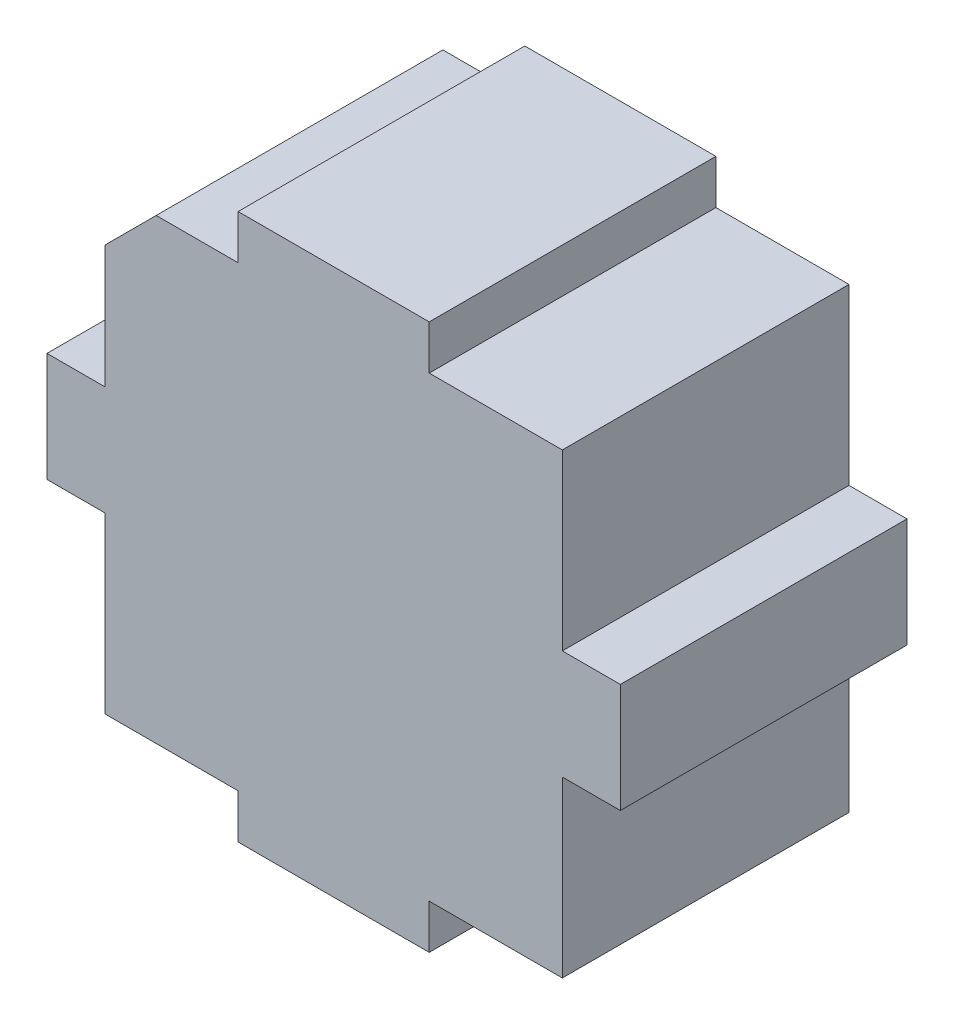
ISO-10303-21;
HEADER;
FILE_DESCRIPTION(('STEP AP214'),'2;1');
FILE_NAME('part.step','',(''),(''),'','','');
FILE_SCHEMA(('AUTOMOTIVE_DESIGN { 1 0 10303 214 1 1 1 1 }'));
ENDSEC;
DATA;
#1=APPLICATION_CONTEXT('core data for automotive mechanical design processes');
#2=APPLICATION_PROTOCOL_DEFINITION('international standard','automotive_design',2000,#1);
#3=PRODUCT_CONTEXT('',#1,'mechanical');
#4=PRODUCT('Part','Part','',(#3));
#5=PRODUCT_RELATED_PRODUCT_CATEGORY('part','',(#4));
#6=PRODUCT_DEFINITION_FORMATION('','',#4);
#7=PRODUCT_DEFINITION_CONTEXT('part definition',#1,'design');
#8=PRODUCT_DEFINITION('design','',#6,#7);
#9=PRODUCT_DEFINITION_SHAPE('','',#8);
#10=(LENGTH_UNIT() NAMED_UNIT(*) SI_UNIT(.MILLI.,.METRE.));
#11=(NAMED_UNIT(*) PLANE_ANGLE_UNIT() SI_UNIT($,.RADIAN.));
#12=(NAMED_UNIT(*) SI_UNIT($,.STERADIAN.) SOLID_ANGLE_UNIT());
#13=UNCERTAINTY_MEASURE_WITH_UNIT(LENGTH_MEASURE(1.E-05),#10,'distance_accuracy_value','');
#14=(GEOMETRIC_REPRESENTATION_CONTEXT(3) GLOBAL_UNCERTAINTY_ASSIGNED_CONTEXT((#13)) GLOBAL_UNIT_ASSIGNED_CONTEXT((#10,
#11,#12)) REPRESENTATION_CONTEXT('',''));
#15=CARTESIAN_POINT('',(0.,0.,0.));
#16=DIRECTION('',(0.,0.,1.));
#17=DIRECTION('',(1.,0.,0.));
#18=AXIS2_PLACEMENT_3D('',#15,#16,#17);
#19=CARTESIAN_POINT('',(-0.7,2.,2.1));
#20=DIRECTION('',(0.,-1.,0.));
#21=DIRECTION('',(0.,0.,-1.));
#22=AXIS2_PLACEMENT_3D('',#19,#20,#21);
#23=PLANE('',#22);
#24=DIRECTION('',(-1.,0.,0.));
#25=VECTOR('',#24,1.);
#26=CARTESIAN_POINT('',(-0.7,2.,0.));
#27=LINE('',#26,#25);
#28=CARTESIAN_POINT('',(0.7,2.,0.));
#29=VERTEX_POINT('',#28);
#30=CARTESIAN_POINT('',(-0.7,2.,0.));
#31=VERTEX_POINT('',#30);
#32=EDGE_CURVE('E208',#29,#31,#27,.T.);
#33=ORIENTED_EDGE('',*,*,#32,.T.);
#34=DIRECTION('',(0.,0.,-1.));
#35=VECTOR('',#34,1.);
#36=CARTESIAN_POINT('',(-0.7,2.,2.1));
#37=LINE('',#36,#35);
#38=CARTESIAN_POINT('',(-0.7,2.,2.1));
#39=VERTEX_POINT('',#38);
#40=EDGE_CURVE('E11',#39,#31,#37,.T.);
#41=ORIENTED_EDGE('',*,*,#40,.F.);
#42=DIRECTION('',(-1.,0.,0.));
#43=VECTOR('',#42,1.);
#44=CARTESIAN_POINT('',(-0.7,2.,2.1));
#45=LINE('',#44,#43);
#46=CARTESIAN_POINT('',(0.7,2.,2.1));
#47=VERTEX_POINT('',#46);
#48=EDGE_CURVE('E248',#47,#39,#45,.T.);
#49=ORIENTED_EDGE('',*,*,#48,.F.);
#50=DIRECTION('',(0.,0.,-1.));
#51=VECTOR('',#50,1.);
#52=CARTESIAN_POINT('',(0.7,2.,2.1));
#53=LINE('',#52,#51);
#54=EDGE_CURVE('E204',#47,#29,#53,.T.);
#55=ORIENTED_EDGE('',*,*,#54,.T.);
#56=EDGE_LOOP('',(#33,#41,#49,#55));
#57=FACE_BOUND('',#56,.T.);
#58=ADVANCED_FACE('F34',(#57),#23,.F.);
#59=CARTESIAN_POINT('',(-0.7,1.675,2.1));
#60=DIRECTION('',(1.,0.,0.));
#61=DIRECTION('',(0.,0.,-1.));
#62=AXIS2_PLACEMENT_3D('',#59,#60,#61);
#63=PLANE('',#62);
#64=DIRECTION('',(0.,-1.,0.));
#65=VECTOR('',#64,1.);
#66=CARTESIAN_POINT('',(-0.7,1.675,0.));
#67=LINE('',#66,#65);
#68=CARTESIAN_POINT('',(-0.7,1.675,0.));
#69=VERTEX_POINT('',#68);
#70=EDGE_CURVE('E211',#31,#69,#67,.T.);
#71=ORIENTED_EDGE('',*,*,#70,.T.);
#72=DIRECTION('',(0.,0.,-1.));
#73=VECTOR('',#72,1.);
#74=CARTESIAN_POINT('',(-0.7,1.675,2.1));
#75=LINE('',#74,#73);
#76=CARTESIAN_POINT('',(-0.7,1.675,2.1));
#77=VERTEX_POINT('',#76);
#78=EDGE_CURVE('E42',#77,#69,#75,.T.);
#79=ORIENTED_EDGE('',*,*,#78,.F.);
#80=DIRECTION('',(0.,-1.,0.));
#81=VECTOR('',#80,1.);
#82=CARTESIAN_POINT('',(-0.7,1.675,2.1));
#83=LINE('',#82,#81);
#84=EDGE_CURVE('E132',#39,#77,#83,.T.);
#85=ORIENTED_EDGE('',*,*,#84,.F.);
#86=ORIENTED_EDGE('',*,*,#40,.T.);
#87=EDGE_LOOP('',(#71,#79,#85,#86));
#88=FACE_BOUND('',#87,.T.);
#89=ADVANCED_FACE('F371',(#88),#63,.F.);
#90=CARTESIAN_POINT('',(-1.3,1.675,2.1));
#91=DIRECTION('',(0.,-1.,0.));
#92=DIRECTION('',(0.,0.,-1.));
#93=AXIS2_PLACEMENT_3D('',#90,#91,#92);
#94=PLANE('',#93);
#95=DIRECTION('',(-1.,0.,0.));
#96=VECTOR('',#95,1.);
#97=CARTESIAN_POINT('',(-1.3,1.675,0.));
#98=LINE('',#97,#96);
#99=CARTESIAN_POINT('',(-1.3,1.675,0.));
#100=VERTEX_POINT('',#99);
#101=EDGE_CURVE('E213',#69,#100,#98,.T.);
#102=ORIENTED_EDGE('',*,*,#101,.T.);
#103=DIRECTION('',(0.,0.,-1.));
#104=VECTOR('',#103,1.);
#105=CARTESIAN_POINT('',(-1.3,1.675,2.1));
#106=LINE('',#105,#104);
#107=CARTESIAN_POINT('',(-1.3,1.675,2.1));
#108=VERTEX_POINT('',#107);
#109=EDGE_CURVE('E294',#108,#100,#106,.T.);
#110=ORIENTED_EDGE('',*,*,#109,.F.);
#111=DIRECTION('',(-1.,0.,0.));
#112=VECTOR('',#111,1.);
#113=CARTESIAN_POINT('',(-1.3,1.675,2.1));
#114=LINE('',#113,#112);
#115=EDGE_CURVE('E302',#77,#108,#114,.T.);
#116=ORIENTED_EDGE('',*,*,#115,.F.);
#117=ORIENTED_EDGE('',*,*,#78,.T.);
#118=EDGE_LOOP('',(#102,#110,#116,#117));
#119=FACE_BOUND('',#118,.T.);
#120=ADVANCED_FACE('F300',(#119),#94,.F.);
#121=CARTESIAN_POINT('',(-1.675,1.3,2.1));
#122=DIRECTION('',(0.707106781186548,-0.707106781186548,0.));
#123=DIRECTION('',(0.707106781186548,0.707106781186548,0.));
#124=AXIS2_PLACEMENT_3D('',#121,#122,#123);
#125=PLANE('',#124);
#126=DIRECTION('',(-0.707106781186547,-0.707106781186547,0.));
#127=VECTOR('',#126,1.);
#128=CARTESIAN_POINT('',(-1.675,1.3,0.));
#129=LINE('',#128,#127);
#130=CARTESIAN_POINT('',(-1.675,1.3,0.));
#131=VERTEX_POINT('',#130);
#132=EDGE_CURVE('E215',#100,#131,#129,.T.);
#133=ORIENTED_EDGE('',*,*,#132,.T.);
#134=DIRECTION('',(0.,0.,-1.));
#135=VECTOR('',#134,1.);
#136=CARTESIAN_POINT('',(-1.675,1.3,2.1));
#137=LINE('',#136,#135);
#138=CARTESIAN_POINT('',(-1.675,1.3,2.1));
#139=VERTEX_POINT('',#138);
#140=EDGE_CURVE('E291',#139,#131,#137,.T.);
#141=ORIENTED_EDGE('',*,*,#140,.F.);
#142=DIRECTION('',(-0.707106781186547,-0.707106781186547,0.));
#143=VECTOR('',#142,1.);
#144=CARTESIAN_POINT('',(-1.675,1.3,2.1));
#145=LINE('',#144,#143);
#146=EDGE_CURVE('E320',#108,#139,#145,.T.);
#147=ORIENTED_EDGE('',*,*,#146,.F.);
#148=ORIENTED_EDGE('',*,*,#109,.T.);
#149=EDGE_LOOP('',(#133,#141,#147,#148));
#150=FACE_BOUND('',#149,.T.);
#151=ADVANCED_FACE('F311',(#150),#125,.F.);
#152=CARTESIAN_POINT('',(-1.675,0.4,2.1));
#153=DIRECTION('',(1.,0.,0.));
#154=DIRECTION('',(0.,0.,-1.));
#155=AXIS2_PLACEMENT_3D('',#152,#153,#154);
#156=PLANE('',#155);
#157=DIRECTION('',(0.,-1.,0.));
#158=VECTOR('',#157,1.);
#159=CARTESIAN_POINT('',(-1.675,0.4,0.));
#160=LINE('',#159,#158);
#161=CARTESIAN_POINT('',(-1.675,0.4,0.));
#162=VERTEX_POINT('',#161);
#163=EDGE_CURVE('E217',#131,#162,#160,.T.);
#164=ORIENTED_EDGE('',*,*,#163,.T.);
#165=DIRECTION('',(0.,0.,-1.));
#166=VECTOR('',#165,1.);
#167=CARTESIAN_POINT('',(-1.675,0.4,2.1));
#168=LINE('',#167,#166);
#169=CARTESIAN_POINT('',(-1.675,0.4,2.1));
#170=VERTEX_POINT('',#169);
#171=EDGE_CURVE('E288',#170,#162,#168,.T.);
#172=ORIENTED_EDGE('',*,*,#171,.F.);
#173=DIRECTION('',(0.,-1.,0.));
#174=VECTOR('',#173,1.);
#175=CARTESIAN_POINT('',(-1.675,0.4,2.1));
#176=LINE('',#175,#174);
#177=EDGE_CURVE('E317',#139,#170,#176,.T.);
#178=ORIENTED_EDGE('',*,*,#177,.F.);
#179=ORIENTED_EDGE('',*,*,#140,.T.);
#180=EDGE_LOOP('',(#164,#172,#178,#179));
#181=FACE_BOUND('',#180,.T.);
#182=ADVANCED_FACE('F315',(#181),#156,.F.);
#183=CARTESIAN_POINT('',(-2.1,0.4,2.1));
#184=DIRECTION('',(0.,-1.,0.));
#185=DIRECTION('',(0.,0.,-1.));
#186=AXIS2_PLACEMENT_3D('',#183,#184,#185);
#187=PLANE('',#186);
#188=DIRECTION('',(-1.,0.,0.));
#189=VECTOR('',#188,1.);
#190=CARTESIAN_POINT('',(-2.1,0.4,0.));
#191=LINE('',#190,#189);
#192=CARTESIAN_POINT('',(-2.1,0.4,0.));
#193=VERTEX_POINT('',#192);
#194=EDGE_CURVE('E219',#162,#193,#191,.T.);
#195=ORIENTED_EDGE('',*,*,#194,.T.);
#196=DIRECTION('',(0.,0.,-1.));
#197=VECTOR('',#196,1.);
#198=CARTESIAN_POINT('',(-2.1,0.4,2.1));
#199=LINE('',#198,#197);
#200=CARTESIAN_POINT('',(-2.1,0.4,2.1));
#201=VERTEX_POINT('',#200);
#202=EDGE_CURVE('E285',#201,#193,#199,.T.);
#203=ORIENTED_EDGE('',*,*,#202,.F.);
#204=DIRECTION('',(-1.,0.,0.));
#205=VECTOR('',#204,1.);
#206=CARTESIAN_POINT('',(-2.1,0.4,2.1));
#207=LINE('',#206,#205);
#208=EDGE_CURVE('E319',#170,#201,#207,.T.);
#209=ORIENTED_EDGE('',*,*,#208,.F.);
#210=ORIENTED_EDGE('',*,*,#171,.T.);
#211=EDGE_LOOP('',(#195,#203,#209,#210));
#212=FACE_BOUND('',#211,.T.);
#213=ADVANCED_FACE('F384',(#212),#187,.F.);
#214=CARTESIAN_POINT('',(-2.1,-0.4,2.1));
#215=DIRECTION('',(1.,0.,0.));
#216=DIRECTION('',(0.,0.,-1.));
#217=AXIS2_PLACEMENT_3D('',#214,#215,#216);
#218=PLANE('',#217);
#219=DIRECTION('',(0.,-1.,0.));
#220=VECTOR('',#219,1.);
#221=CARTESIAN_POINT('',(-2.1,-0.4,0.));
#222=LINE('',#221,#220);
#223=CARTESIAN_POINT('',(-2.1,-0.4,0.));
#224=VERTEX_POINT('',#223);
#225=EDGE_CURVE('E221',#193,#224,#222,.T.);
#226=ORIENTED_EDGE('',*,*,#225,.T.);
#227=DIRECTION('',(0.,0.,-1.));
#228=VECTOR('',#227,1.);
#229=CARTESIAN_POINT('',(-2.1,-0.4,2.1));
#230=LINE('',#229,#228);
#231=CARTESIAN_POINT('',(-2.1,-0.4,2.1));
#232=VERTEX_POINT('',#231);
#233=EDGE_CURVE('E282',#232,#224,#230,.T.);
#234=ORIENTED_EDGE('',*,*,#233,.F.);
#235=DIRECTION('',(0.,-1.,0.));
#236=VECTOR('',#235,1.);
#237=CARTESIAN_POINT('',(-2.1,-0.4,2.1));
#238=LINE('',#237,#236);
#239=EDGE_CURVE('E322',#201,#232,#238,.T.);
#240=ORIENTED_EDGE('',*,*,#239,.F.);
#241=ORIENTED_EDGE('',*,*,#202,.T.);
#242=EDGE_LOOP('',(#226,#234,#240,#241));
#243=FACE_BOUND('',#242,.T.);
#244=ADVANCED_FACE('F387',(#243),#218,.F.);
#245=CARTESIAN_POINT('',(-1.675,-0.4,2.1));
#246=DIRECTION('',(0.,1.,0.));
#247=DIRECTION('',(0.,0.,1.));
#248=AXIS2_PLACEMENT_3D('',#245,#246,#247);
#249=PLANE('',#248);
#250=DIRECTION('',(1.,0.,0.));
#251=VECTOR('',#250,1.);
#252=CARTESIAN_POINT('',(-1.675,-0.4,0.));
#253=LINE('',#252,#251);
#254=CARTESIAN_POINT('',(-1.675,-0.4,0.));
#255=VERTEX_POINT('',#254);
#256=EDGE_CURVE('E223',#224,#255,#253,.T.);
#257=ORIENTED_EDGE('',*,*,#256,.T.);
#258=DIRECTION('',(0.,0.,-1.));
#259=VECTOR('',#258,1.);
#260=CARTESIAN_POINT('',(-1.675,-0.4,2.1));
#261=LINE('',#260,#259);
#262=CARTESIAN_POINT('',(-1.675,-0.4,2.1));
#263=VERTEX_POINT('',#262);
#264=EDGE_CURVE('E279',#263,#255,#261,.T.);
#265=ORIENTED_EDGE('',*,*,#264,.F.);
#266=DIRECTION('',(1.,0.,0.));
#267=VECTOR('',#266,1.);
#268=CARTESIAN_POINT('',(-1.675,-0.4,2.1));
#269=LINE('',#268,#267);
#270=EDGE_CURVE('E328',#232,#263,#269,.T.);
#271=ORIENTED_EDGE('',*,*,#270,.F.);
#272=ORIENTED_EDGE('',*,*,#233,.T.);
#273=EDGE_LOOP('',(#257,#265,#271,#272));
#274=FACE_BOUND('',#273,.T.);
#275=ADVANCED_FACE('F391',(#274),#249,.F.);
#276=CARTESIAN_POINT('',(-1.675,-1.675,2.1));
#277=DIRECTION('',(1.,0.,0.));
#278=DIRECTION('',(0.,0.,-1.));
#279=AXIS2_PLACEMENT_3D('',#276,#277,#278);
#280=PLANE('',#279);
#281=DIRECTION('',(0.,-1.,0.));
#282=VECTOR('',#281,1.);
#283=CARTESIAN_POINT('',(-1.675,-1.675,0.));
#284=LINE('',#283,#282);
#285=CARTESIAN_POINT('',(-1.675,-1.675,0.));
#286=VERTEX_POINT('',#285);
#287=EDGE_CURVE('E225',#255,#286,#284,.T.);
#288=ORIENTED_EDGE('',*,*,#287,.T.);
#289=DIRECTION('',(0.,0.,-1.));
#290=VECTOR('',#289,1.);
#291=CARTESIAN_POINT('',(-1.675,-1.675,2.1));
#292=LINE('',#291,#290);
#293=CARTESIAN_POINT('',(-1.675,-1.675,2.1));
#294=VERTEX_POINT('',#293);
#295=EDGE_CURVE('E276',#294,#286,#292,.T.);
#296=ORIENTED_EDGE('',*,*,#295,.F.);
#297=DIRECTION('',(0.,-1.,0.));
#298=VECTOR('',#297,1.);
#299=CARTESIAN_POINT('',(-1.675,-1.675,2.1));
#300=LINE('',#299,#298);
#301=EDGE_CURVE('E330',#263,#294,#300,.T.);
#302=ORIENTED_EDGE('',*,*,#301,.F.);
#303=ORIENTED_EDGE('',*,*,#264,.T.);
#304=EDGE_LOOP('',(#288,#296,#302,#303));
#305=FACE_BOUND('',#304,.T.);
#306=ADVANCED_FACE('F395',(#305),#280,.F.);
#307=CARTESIAN_POINT('',(-0.7,-1.675,2.1));
#308=DIRECTION('',(0.,1.,0.));
#309=DIRECTION('',(0.,0.,1.));
#310=AXIS2_PLACEMENT_3D('',#307,#308,#309);
#311=PLANE('',#310);
#312=DIRECTION('',(1.,0.,0.));
#313=VECTOR('',#312,1.);
#314=CARTESIAN_POINT('',(-0.7,-1.675,0.));
#315=LINE('',#314,#313);
#316=CARTESIAN_POINT('',(-0.7,-1.675,0.));
#317=VERTEX_POINT('',#316);
#318=EDGE_CURVE('E227',#286,#317,#315,.T.);
#319=ORIENTED_EDGE('',*,*,#318,.T.);
#320=DIRECTION('',(0.,0.,-1.));
#321=VECTOR('',#320,1.);
#322=CARTESIAN_POINT('',(-0.7,-1.675,2.1));
#323=LINE('',#322,#321);
#324=CARTESIAN_POINT('',(-0.7,-1.675,2.1));
#325=VERTEX_POINT('',#324);
#326=EDGE_CURVE('E273',#325,#317,#323,.T.);
#327=ORIENTED_EDGE('',*,*,#326,.F.);
#328=DIRECTION('',(1.,0.,0.));
#329=VECTOR('',#328,1.);
#330=CARTESIAN_POINT('',(-0.7,-1.675,2.1));
#331=LINE('',#330,#329);
#332=EDGE_CURVE('E332',#294,#325,#331,.T.);
#333=ORIENTED_EDGE('',*,*,#332,.F.);
#334=ORIENTED_EDGE('',*,*,#295,.T.);
#335=EDGE_LOOP('',(#319,#327,#333,#334));
#336=FACE_BOUND('',#335,.T.);
#337=ADVANCED_FACE('F399',(#336),#311,.F.);
#338=CARTESIAN_POINT('',(-0.7,-2.,2.1));
#339=DIRECTION('',(1.,0.,0.));
#340=DIRECTION('',(0.,0.,-1.));
#341=AXIS2_PLACEMENT_3D('',#338,#339,#340);
#342=PLANE('',#341);
#343=DIRECTION('',(0.,-1.,0.));
#344=VECTOR('',#343,1.);
#345=CARTESIAN_POINT('',(-0.7,-2.,0.));
#346=LINE('',#345,#344);
#347=CARTESIAN_POINT('',(-0.7,-2.,0.));
#348=VERTEX_POINT('',#347);
#349=EDGE_CURVE('E229',#317,#348,#346,.T.);
#350=ORIENTED_EDGE('',*,*,#349,.T.);
#351=DIRECTION('',(0.,0.,-1.));
#352=VECTOR('',#351,1.);
#353=CARTESIAN_POINT('',(-0.7,-2.,2.1));
#354=LINE('',#353,#352);
#355=CARTESIAN_POINT('',(-0.7,-2.,2.1));
#356=VERTEX_POINT('',#355);
#357=EDGE_CURVE('E270',#356,#348,#354,.T.);
#358=ORIENTED_EDGE('',*,*,#357,.F.);
#359=DIRECTION('',(0.,-1.,0.));
#360=VECTOR('',#359,1.);
#361=CARTESIAN_POINT('',(-0.7,-2.,2.1));
#362=LINE('',#361,#360);
#363=EDGE_CURVE('E334',#325,#356,#362,.T.);
#364=ORIENTED_EDGE('',*,*,#363,.F.);
#365=ORIENTED_EDGE('',*,*,#326,.T.);
#366=EDGE_LOOP('',(#350,#358,#364,#365));
#367=FACE_BOUND('',#366,.T.);
#368=ADVANCED_FACE('F403',(#367),#342,.F.);
#369=CARTESIAN_POINT('',(0.7,-2.,2.1));
#370=DIRECTION('',(0.,1.,0.));
#371=DIRECTION('',(0.,0.,1.));
#372=AXIS2_PLACEMENT_3D('',#369,#370,#371);
#373=PLANE('',#372);
#374=DIRECTION('',(1.,0.,0.));
#375=VECTOR('',#374,1.);
#376=CARTESIAN_POINT('',(0.7,-2.,0.));
#377=LINE('',#376,#375);
#378=CARTESIAN_POINT('',(0.7,-2.,0.));
#379=VERTEX_POINT('',#378);
#380=EDGE_CURVE('E231',#348,#379,#377,.T.);
#381=ORIENTED_EDGE('',*,*,#380,.T.);
#382=DIRECTION('',(0.,0.,-1.));
#383=VECTOR('',#382,1.);
#384=CARTESIAN_POINT('',(0.7,-2.,2.1));
#385=LINE('',#384,#383);
#386=CARTESIAN_POINT('',(0.7,-2.,2.1));
#387=VERTEX_POINT('',#386);
#388=EDGE_CURVE('E267',#387,#379,#385,.T.);
#389=ORIENTED_EDGE('',*,*,#388,.F.);
#390=DIRECTION('',(1.,0.,0.));
#391=VECTOR('',#390,1.);
#392=CARTESIAN_POINT('',(0.7,-2.,2.1));
#393=LINE('',#392,#391);
#394=EDGE_CURVE('E336',#356,#387,#393,.T.);
#395=ORIENTED_EDGE('',*,*,#394,.F.);
#396=ORIENTED_EDGE('',*,*,#357,.T.);
#397=EDGE_LOOP('',(#381,#389,#395,#396));
#398=FACE_BOUND('',#397,.T.);
#399=ADVANCED_FACE('F407',(#398),#373,.F.);
#400=CARTESIAN_POINT('',(0.7,-1.675,2.1));
#401=DIRECTION('',(-1.,0.,0.));
#402=DIRECTION('',(0.,0.,1.));
#403=AXIS2_PLACEMENT_3D('',#400,#401,#402);
#404=PLANE('',#403);
#405=DIRECTION('',(0.,1.,0.));
#406=VECTOR('',#405,1.);
#407=CARTESIAN_POINT('',(0.7,-1.675,0.));
#408=LINE('',#407,#406);
#409=CARTESIAN_POINT('',(0.7,-1.675,0.));
#410=VERTEX_POINT('',#409);
#411=EDGE_CURVE('E233',#379,#410,#408,.T.);
#412=ORIENTED_EDGE('',*,*,#411,.T.);
#413=DIRECTION('',(0.,0.,-1.));
#414=VECTOR('',#413,1.);
#415=CARTESIAN_POINT('',(0.7,-1.675,2.1));
#416=LINE('',#415,#414);
#417=CARTESIAN_POINT('',(0.7,-1.675,2.1));
#418=VERTEX_POINT('',#417);
#419=EDGE_CURVE('E264',#418,#410,#416,.T.);
#420=ORIENTED_EDGE('',*,*,#419,.F.);
#421=DIRECTION('',(0.,1.,0.));
#422=VECTOR('',#421,1.);
#423=CARTESIAN_POINT('',(0.7,-1.675,2.1));
#424=LINE('',#423,#422);
#425=EDGE_CURVE('E338',#387,#418,#424,.T.);
#426=ORIENTED_EDGE('',*,*,#425,.F.);
#427=ORIENTED_EDGE('',*,*,#388,.T.);
#428=EDGE_LOOP('',(#412,#420,#426,#427));
#429=FACE_BOUND('',#428,.T.);
#430=ADVANCED_FACE('F411',(#429),#404,.F.);
#431=CARTESIAN_POINT('',(1.675,-1.675,2.1));
#432=DIRECTION('',(0.,1.,0.));
#433=DIRECTION('',(0.,0.,1.));
#434=AXIS2_PLACEMENT_3D('',#431,#432,#433);
#435=PLANE('',#434);
#436=DIRECTION('',(1.,0.,0.));
#437=VECTOR('',#436,1.);
#438=CARTESIAN_POINT('',(1.675,-1.675,0.));
#439=LINE('',#438,#437);
#440=CARTESIAN_POINT('',(1.675,-1.675,0.));
#441=VERTEX_POINT('',#440);
#442=EDGE_CURVE('E235',#410,#441,#439,.T.);
#443=ORIENTED_EDGE('',*,*,#442,.T.);
#444=DIRECTION('',(0.,0.,-1.));
#445=VECTOR('',#444,1.);
#446=CARTESIAN_POINT('',(1.675,-1.675,2.1));
#447=LINE('',#446,#445);
#448=CARTESIAN_POINT('',(1.675,-1.675,2.1));
#449=VERTEX_POINT('',#448);
#450=EDGE_CURVE('E261',#449,#441,#447,.T.);
#451=ORIENTED_EDGE('',*,*,#450,.F.);
#452=DIRECTION('',(1.,0.,0.));
#453=VECTOR('',#452,1.);
#454=CARTESIAN_POINT('',(1.675,-1.675,2.1));
#455=LINE('',#454,#453);
#456=EDGE_CURVE('E340',#418,#449,#455,.T.);
#457=ORIENTED_EDGE('',*,*,#456,.F.);
#458=ORIENTED_EDGE('',*,*,#419,.T.);
#459=EDGE_LOOP('',(#443,#451,#457,#458));
#460=FACE_BOUND('',#459,.T.);
#461=ADVANCED_FACE('F415',(#460),#435,.F.);
#462=CARTESIAN_POINT('',(1.675,-0.4,2.1));
#463=DIRECTION('',(-1.,0.,0.));
#464=DIRECTION('',(0.,0.,1.));
#465=AXIS2_PLACEMENT_3D('',#462,#463,#464);
#466=PLANE('',#465);
#467=DIRECTION('',(0.,1.,0.));
#468=VECTOR('',#467,1.);
#469=CARTESIAN_POINT('',(1.675,-0.4,0.));
#470=LINE('',#469,#468);
#471=CARTESIAN_POINT('',(1.675,-0.4,0.));
#472=VERTEX_POINT('',#471);
#473=EDGE_CURVE('E237',#441,#472,#470,.T.);
#474=ORIENTED_EDGE('',*,*,#473,.T.);
#475=DIRECTION('',(0.,0.,-1.));
#476=VECTOR('',#475,1.);
#477=CARTESIAN_POINT('',(1.675,-0.4,2.1));
#478=LINE('',#477,#476);
#479=CARTESIAN_POINT('',(1.675,-0.4,2.1));
#480=VERTEX_POINT('',#479);
#481=EDGE_CURVE('E258',#480,#472,#478,.T.);
#482=ORIENTED_EDGE('',*,*,#481,.F.);
#483=DIRECTION('',(0.,1.,0.));
#484=VECTOR('',#483,1.);
#485=CARTESIAN_POINT('',(1.675,-0.4,2.1));
#486=LINE('',#485,#484);
#487=EDGE_CURVE('E342',#449,#480,#486,.T.);
#488=ORIENTED_EDGE('',*,*,#487,.F.);
#489=ORIENTED_EDGE('',*,*,#450,.T.);
#490=EDGE_LOOP('',(#474,#482,#488,#489));
#491=FACE_BOUND('',#490,.T.);
#492=ADVANCED_FACE('F419',(#491),#466,.F.);
#493=CARTESIAN_POINT('',(2.1,-0.4,2.1));
#494=DIRECTION('',(0.,1.,0.));
#495=DIRECTION('',(0.,0.,1.));
#496=AXIS2_PLACEMENT_3D('',#493,#494,#495);
#497=PLANE('',#496);
#498=DIRECTION('',(1.,0.,0.));
#499=VECTOR('',#498,1.);
#500=CARTESIAN_POINT('',(2.1,-0.4,0.));
#501=LINE('',#500,#499);
#502=CARTESIAN_POINT('',(2.1,-0.4,0.));
#503=VERTEX_POINT('',#502);
#504=EDGE_CURVE('E239',#472,#503,#501,.T.);
#505=ORIENTED_EDGE('',*,*,#504,.T.);
#506=DIRECTION('',(0.,0.,-1.));
#507=VECTOR('',#506,1.);
#508=CARTESIAN_POINT('',(2.1,-0.4,2.1));
#509=LINE('',#508,#507);
#510=CARTESIAN_POINT('',(2.1,-0.4,2.1));
#511=VERTEX_POINT('',#510);
#512=EDGE_CURVE('E255',#511,#503,#509,.T.);
#513=ORIENTED_EDGE('',*,*,#512,.F.);
#514=DIRECTION('',(1.,0.,0.));
#515=VECTOR('',#514,1.);
#516=CARTESIAN_POINT('',(2.1,-0.4,2.1));
#517=LINE('',#516,#515);
#518=EDGE_CURVE('E344',#480,#511,#517,.T.);
#519=ORIENTED_EDGE('',*,*,#518,.F.);
#520=ORIENTED_EDGE('',*,*,#481,.T.);
#521=EDGE_LOOP('',(#505,#513,#519,#520));
#522=FACE_BOUND('',#521,.T.);
#523=ADVANCED_FACE('F423',(#522),#497,.F.);
#524=CARTESIAN_POINT('',(2.1,0.4,2.1));
#525=DIRECTION('',(-1.,0.,0.));
#526=DIRECTION('',(0.,0.,1.));
#527=AXIS2_PLACEMENT_3D('',#524,#525,#526);
#528=PLANE('',#527);
#529=DIRECTION('',(0.,1.,0.));
#530=VECTOR('',#529,1.);
#531=CARTESIAN_POINT('',(2.1,0.4,0.));
#532=LINE('',#531,#530);
#533=CARTESIAN_POINT('',(2.1,0.4,0.));
#534=VERTEX_POINT('',#533);
#535=EDGE_CURVE('E241',#503,#534,#532,.T.);
#536=ORIENTED_EDGE('',*,*,#535,.T.);
#537=DIRECTION('',(0.,0.,-1.));
#538=VECTOR('',#537,1.);
#539=CARTESIAN_POINT('',(2.1,0.4,2.1));
#540=LINE('',#539,#538);
#541=CARTESIAN_POINT('',(2.1,0.4,2.1));
#542=VERTEX_POINT('',#541);
#543=EDGE_CURVE('E252',#542,#534,#540,.T.);
#544=ORIENTED_EDGE('',*,*,#543,.F.);
#545=DIRECTION('',(0.,1.,0.));
#546=VECTOR('',#545,1.);
#547=CARTESIAN_POINT('',(2.1,0.4,2.1));
#548=LINE('',#547,#546);
#549=EDGE_CURVE('E346',#511,#542,#548,.T.);
#550=ORIENTED_EDGE('',*,*,#549,.F.);
#551=ORIENTED_EDGE('',*,*,#512,.T.);
#552=EDGE_LOOP('',(#536,#544,#550,#551));
#553=FACE_BOUND('',#552,.T.);
#554=ADVANCED_FACE('F352',(#553),#528,.F.);
#555=CARTESIAN_POINT('',(1.675,0.4,2.1));
#556=DIRECTION('',(0.,-1.,0.));
#557=DIRECTION('',(0.,0.,-1.));
#558=AXIS2_PLACEMENT_3D('',#555,#556,#557);
#559=PLANE('',#558);
#560=DIRECTION('',(-1.,0.,0.));
#561=VECTOR('',#560,1.);
#562=CARTESIAN_POINT('',(1.675,0.4,0.));
#563=LINE('',#562,#561);
#564=CARTESIAN_POINT('',(1.675,0.4,0.));
#565=VERTEX_POINT('',#564);
#566=EDGE_CURVE('E243',#534,#565,#563,.T.);
#567=ORIENTED_EDGE('',*,*,#566,.T.);
#568=DIRECTION('',(0.,0.,-1.));
#569=VECTOR('',#568,1.);
#570=CARTESIAN_POINT('',(1.675,0.4,2.1));
#571=LINE('',#570,#569);
#572=CARTESIAN_POINT('',(1.675,0.4,2.1));
#573=VERTEX_POINT('',#572);
#574=EDGE_CURVE('E199',#573,#565,#571,.T.);
#575=ORIENTED_EDGE('',*,*,#574,.F.);
#576=DIRECTION('',(-1.,0.,0.));
#577=VECTOR('',#576,1.);
#578=CARTESIAN_POINT('',(1.675,0.4,2.1));
#579=LINE('',#578,#577);
#580=EDGE_CURVE('E190',#542,#573,#579,.T.);
#581=ORIENTED_EDGE('',*,*,#580,.F.);
#582=ORIENTED_EDGE('',*,*,#543,.T.);
#583=EDGE_LOOP('',(#567,#575,#581,#582));
#584=FACE_BOUND('',#583,.T.);
#585=ADVANCED_FACE('F356',(#584),#559,.F.);
#586=CARTESIAN_POINT('',(1.675,1.675,2.1));
#587=DIRECTION('',(-1.,0.,0.));
#588=DIRECTION('',(0.,0.,1.));
#589=AXIS2_PLACEMENT_3D('',#586,#587,#588);
#590=PLANE('',#589);
#591=DIRECTION('',(0.,1.,0.));
#592=VECTOR('',#591,1.);
#593=CARTESIAN_POINT('',(1.675,1.675,0.));
#594=LINE('',#593,#592);
#595=CARTESIAN_POINT('',(1.675,1.675,0.));
#596=VERTEX_POINT('',#595);
#597=EDGE_CURVE('E198',#565,#596,#594,.T.);
#598=ORIENTED_EDGE('',*,*,#597,.T.);
#599=DIRECTION('',(0.,0.,-1.));
#600=VECTOR('',#599,1.);
#601=CARTESIAN_POINT('',(1.675,1.675,2.1));
#602=LINE('',#601,#600);
#603=CARTESIAN_POINT('',(1.675,1.675,2.1));
#604=VERTEX_POINT('',#603);
#605=EDGE_CURVE('E195',#604,#596,#602,.T.);
#606=ORIENTED_EDGE('',*,*,#605,.F.);
#607=DIRECTION('',(0.,1.,0.));
#608=VECTOR('',#607,1.);
#609=CARTESIAN_POINT('',(1.675,1.675,2.1));
#610=LINE('',#609,#608);
#611=EDGE_CURVE('E184',#573,#604,#610,.T.);
#612=ORIENTED_EDGE('',*,*,#611,.F.);
#613=ORIENTED_EDGE('',*,*,#574,.T.);
#614=EDGE_LOOP('',(#598,#606,#612,#613));
#615=FACE_BOUND('',#614,.T.);
#616=ADVANCED_FACE('F196',(#615),#590,.F.);
#617=CARTESIAN_POINT('',(0.7,1.675,2.1));
#618=DIRECTION('',(0.,-1.,0.));
#619=DIRECTION('',(0.,0.,-1.));
#620=AXIS2_PLACEMENT_3D('',#617,#618,#619);
#621=PLANE('',#620);
#622=DIRECTION('',(-1.,0.,0.));
#623=VECTOR('',#622,1.);
#624=CARTESIAN_POINT('',(0.7,1.675,0.));
#625=LINE('',#624,#623);
#626=CARTESIAN_POINT('',(0.7,1.675,0.));
#627=VERTEX_POINT('',#626);
#628=EDGE_CURVE('E118',#596,#627,#625,.T.);
#629=ORIENTED_EDGE('',*,*,#628,.T.);
#630=DIRECTION('',(0.,0.,-1.));
#631=VECTOR('',#630,1.);
#632=CARTESIAN_POINT('',(0.7,1.675,2.1));
#633=LINE('',#632,#631);
#634=CARTESIAN_POINT('',(0.7,1.675,2.1));
#635=VERTEX_POINT('',#634);
#636=EDGE_CURVE('E200',#635,#627,#633,.T.);
#637=ORIENTED_EDGE('',*,*,#636,.F.);
#638=DIRECTION('',(-1.,0.,0.));
#639=VECTOR('',#638,1.);
#640=CARTESIAN_POINT('',(0.7,1.675,2.1));
#641=LINE('',#640,#639);
#642=EDGE_CURVE('E188',#604,#635,#641,.T.);
#643=ORIENTED_EDGE('',*,*,#642,.F.);
#644=ORIENTED_EDGE('',*,*,#605,.T.);
#645=EDGE_LOOP('',(#629,#637,#643,#644));
#646=FACE_BOUND('',#645,.T.);
#647=ADVANCED_FACE('F202',(#646),#621,.F.);
#648=CARTESIAN_POINT('',(0.7,2.,2.1));
#649=DIRECTION('',(-1.,0.,0.));
#650=DIRECTION('',(0.,0.,1.));
#651=AXIS2_PLACEMENT_3D('',#648,#649,#650);
#652=PLANE('',#651);
#653=DIRECTION('',(0.,1.,0.));
#654=VECTOR('',#653,1.);
#655=CARTESIAN_POINT('',(0.7,2.,0.));
#656=LINE('',#655,#654);
#657=EDGE_CURVE('E124',#627,#29,#656,.T.);
#658=ORIENTED_EDGE('',*,*,#657,.T.);
#659=ORIENTED_EDGE('',*,*,#54,.F.);
#660=DIRECTION('',(0.,1.,0.));
#661=VECTOR('',#660,1.);
#662=CARTESIAN_POINT('',(0.7,2.,2.1));
#663=LINE('',#662,#661);
#664=EDGE_CURVE('E50',#635,#47,#663,.T.);
#665=ORIENTED_EDGE('',*,*,#664,.F.);
#666=ORIENTED_EDGE('',*,*,#636,.T.);
#667=EDGE_LOOP('',(#658,#659,#665,#666));
#668=FACE_BOUND('',#667,.T.);
#669=ADVANCED_FACE('F360',(#668),#652,.F.);
#670=CARTESIAN_POINT('',(0.,0.,2.1));
#671=DIRECTION('',(0.,0.,-1.));
#672=DIRECTION('',(-1.,0.,0.));
#673=AXIS2_PLACEMENT_3D('',#670,#671,#672);
#674=PLANE('',#673);
#675=ORIENTED_EDGE('',*,*,#48,.T.);
#676=ORIENTED_EDGE('',*,*,#84,.T.);
#677=ORIENTED_EDGE('',*,*,#115,.T.);
#678=ORIENTED_EDGE('',*,*,#146,.T.);
#679=ORIENTED_EDGE('',*,*,#177,.T.);
#680=ORIENTED_EDGE('',*,*,#208,.T.);
#681=ORIENTED_EDGE('',*,*,#239,.T.);
#682=ORIENTED_EDGE('',*,*,#270,.T.);
#683=ORIENTED_EDGE('',*,*,#301,.T.);
#684=ORIENTED_EDGE('',*,*,#332,.T.);
#685=ORIENTED_EDGE('',*,*,#363,.T.);
#686=ORIENTED_EDGE('',*,*,#394,.T.);
#687=ORIENTED_EDGE('',*,*,#425,.T.);
#688=ORIENTED_EDGE('',*,*,#456,.T.);
#689=ORIENTED_EDGE('',*,*,#487,.T.);
#690=ORIENTED_EDGE('',*,*,#518,.T.);
#691=ORIENTED_EDGE('',*,*,#549,.T.);
#692=ORIENTED_EDGE('',*,*,#580,.T.);
#693=ORIENTED_EDGE('',*,*,#611,.T.);
#694=ORIENTED_EDGE('',*,*,#642,.T.);
#695=ORIENTED_EDGE('',*,*,#664,.T.);
#696=EDGE_LOOP('',(#675,#676,#677,#678,#679,#680,#681,#682,#683,#684,#685,#686,#687,#688,#689,
#690,#691,#692,#693,#694,#695));
#697=FACE_BOUND('',#696,.T.);
#698=ADVANCED_FACE('F186',(#697),#674,.F.);
#699=CARTESIAN_POINT('',(0.,0.,0.));
#700=DIRECTION('',(0.,0.,-1.));
#701=DIRECTION('',(-1.,0.,0.));
#702=AXIS2_PLACEMENT_3D('',#699,#700,#701);
#703=PLANE('',#702);
#704=ORIENTED_EDGE('',*,*,#32,.F.);
#705=ORIENTED_EDGE('',*,*,#657,.F.);
#706=ORIENTED_EDGE('',*,*,#628,.F.);
#707=ORIENTED_EDGE('',*,*,#597,.F.);
#708=ORIENTED_EDGE('',*,*,#566,.F.);
#709=ORIENTED_EDGE('',*,*,#535,.F.);
#710=ORIENTED_EDGE('',*,*,#504,.F.);
#711=ORIENTED_EDGE('',*,*,#473,.F.);
#712=ORIENTED_EDGE('',*,*,#442,.F.);
#713=ORIENTED_EDGE('',*,*,#411,.F.);
#714=ORIENTED_EDGE('',*,*,#380,.F.);
#715=ORIENTED_EDGE('',*,*,#349,.F.);
#716=ORIENTED_EDGE('',*,*,#318,.F.);
#717=ORIENTED_EDGE('',*,*,#287,.F.);
#718=ORIENTED_EDGE('',*,*,#256,.F.);
#719=ORIENTED_EDGE('',*,*,#225,.F.);
#720=ORIENTED_EDGE('',*,*,#194,.F.);
#721=ORIENTED_EDGE('',*,*,#163,.F.);
#722=ORIENTED_EDGE('',*,*,#132,.F.);
#723=ORIENTED_EDGE('',*,*,#101,.F.);
#724=ORIENTED_EDGE('',*,*,#70,.F.);
#725=EDGE_LOOP('',(#704,#705,#706,#707,#708,#709,#710,#711,#712,#713,#714,#715,#716,#717,#718,
#719,#720,#721,#722,#723,#724));
#726=FACE_BOUND('',#725,.T.);
#727=ADVANCED_FACE('F306',(#726),#703,.T.);
#728=CLOSED_SHELL('',(#58,#89,#120,#151,#182,#213,#244,#275,#306,#337,#368,#399,#430,#461,#492,
#523,#554,#585,#616,#647,#669,#698,#727));
#729=MANIFOLD_SOLID_BREP('B2',#728);
#730=ADVANCED_BREP_SHAPE_REPRESENTATION('',(#18,#729),#14);
#731=SHAPE_DEFINITION_REPRESENTATION(#9,#730);
ENDSEC;
END-ISO-10303-21;
